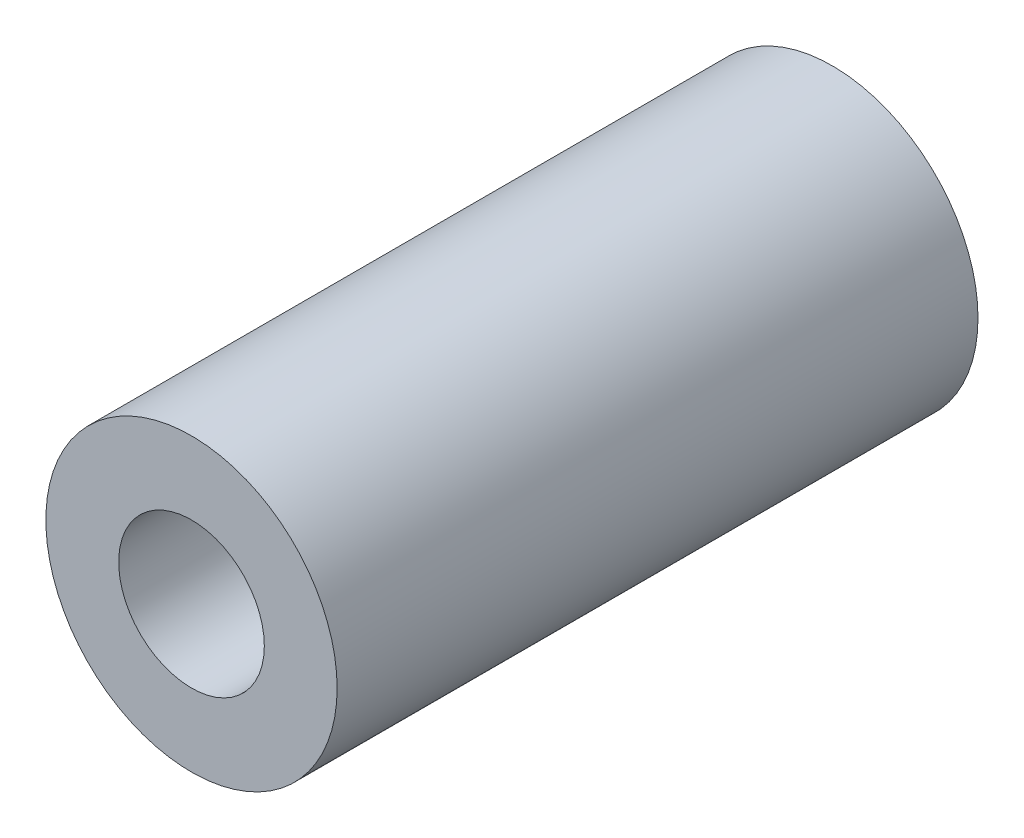
ISO-10303-21;
HEADER;
FILE_DESCRIPTION(('STEP AP214'),'2;1');
FILE_NAME('part.step','',(''),(''),'','','');
FILE_SCHEMA(('AUTOMOTIVE_DESIGN { 1 0 10303 214 1 1 1 1 }'));
ENDSEC;
DATA;
#1=APPLICATION_CONTEXT('core data for automotive mechanical design processes');
#2=APPLICATION_PROTOCOL_DEFINITION('international standard','automotive_design',2000,#1);
#3=PRODUCT_CONTEXT('',#1,'mechanical');
#4=PRODUCT('Part','Part','',(#3));
#5=PRODUCT_RELATED_PRODUCT_CATEGORY('part','',(#4));
#6=PRODUCT_DEFINITION_FORMATION('','',#4);
#7=PRODUCT_DEFINITION_CONTEXT('part definition',#1,'design');
#8=PRODUCT_DEFINITION('design','',#6,#7);
#9=PRODUCT_DEFINITION_SHAPE('','',#8);
#10=(LENGTH_UNIT() NAMED_UNIT(*) SI_UNIT(.MILLI.,.METRE.));
#11=(NAMED_UNIT(*) PLANE_ANGLE_UNIT() SI_UNIT($,.RADIAN.));
#12=(NAMED_UNIT(*) SI_UNIT($,.STERADIAN.) SOLID_ANGLE_UNIT());
#13=UNCERTAINTY_MEASURE_WITH_UNIT(LENGTH_MEASURE(1.E-05),#10,'distance_accuracy_value','');
#14=(GEOMETRIC_REPRESENTATION_CONTEXT(3) GLOBAL_UNCERTAINTY_ASSIGNED_CONTEXT((#13)) GLOBAL_UNIT_ASSIGNED_CONTEXT((#10,
#11,#12)) REPRESENTATION_CONTEXT('',''));
#15=CARTESIAN_POINT('',(0.,0.,0.));
#16=DIRECTION('',(0.,0.,1.));
#17=DIRECTION('',(1.,0.,0.));
#18=AXIS2_PLACEMENT_3D('',#15,#16,#17);
#19=CARTESIAN_POINT('',(0.,0.,22.));
#20=DIRECTION('',(0.,0.,1.));
#21=DIRECTION('',(1.,0.,0.));
#22=AXIS2_PLACEMENT_3D('',#19,#20,#21);
#23=PLANE('',#22);
#24=CARTESIAN_POINT('',(0.,0.,22.));
#25=DIRECTION('',(0.,0.,1.));
#26=DIRECTION('',(1.,0.,0.));
#27=AXIS2_PLACEMENT_3D('',#24,#25,#26);
#28=CIRCLE('',#27,5.);
#29=CARTESIAN_POINT('',(5.,0.,22.));
#30=VERTEX_POINT('',#29);
#31=EDGE_CURVE('E10',#30,#30,#28,.T.);
#32=ORIENTED_EDGE('',*,*,#31,.T.);
#33=EDGE_LOOP('',(#32));
#34=FACE_BOUND('',#33,.T.);
#35=CARTESIAN_POINT('',(0.,0.,22.));
#36=DIRECTION('',(0.,0.,1.));
#37=DIRECTION('',(1.,0.,0.));
#38=AXIS2_PLACEMENT_3D('',#35,#36,#37);
#39=CIRCLE('',#38,2.5);
#40=CARTESIAN_POINT('',(2.5,0.,22.));
#41=VERTEX_POINT('',#40);
#42=EDGE_CURVE('E48',#41,#41,#39,.T.);
#43=ORIENTED_EDGE('',*,*,#42,.F.);
#44=EDGE_LOOP('',(#43));
#45=FACE_BOUND('',#44,.T.);
#46=ADVANCED_FACE('F37',(#34,#45),#23,.T.);
#47=CARTESIAN_POINT('',(0.,0.,0.));
#48=DIRECTION('',(0.,0.,1.));
#49=DIRECTION('',(1.,0.,0.));
#50=AXIS2_PLACEMENT_3D('',#47,#48,#49);
#51=PLANE('',#50);
#52=CARTESIAN_POINT('',(0.,0.,0.));
#53=DIRECTION('',(0.,0.,1.));
#54=DIRECTION('',(1.,0.,0.));
#55=AXIS2_PLACEMENT_3D('',#52,#53,#54);
#56=CIRCLE('',#55,5.);
#57=CARTESIAN_POINT('',(5.,0.,0.));
#58=VERTEX_POINT('',#57);
#59=EDGE_CURVE('E41',#58,#58,#56,.T.);
#60=ORIENTED_EDGE('',*,*,#59,.F.);
#61=EDGE_LOOP('',(#60));
#62=FACE_BOUND('',#61,.T.);
#63=CARTESIAN_POINT('',(0.,0.,0.));
#64=DIRECTION('',(0.,0.,1.));
#65=DIRECTION('',(1.,0.,0.));
#66=AXIS2_PLACEMENT_3D('',#63,#64,#65);
#67=CIRCLE('',#66,2.5);
#68=CARTESIAN_POINT('',(2.5,0.,0.));
#69=VERTEX_POINT('',#68);
#70=EDGE_CURVE('E50',#69,#69,#67,.T.);
#71=ORIENTED_EDGE('',*,*,#70,.T.);
#72=EDGE_LOOP('',(#71));
#73=FACE_BOUND('',#72,.T.);
#74=ADVANCED_FACE('F60',(#62,#73),#51,.F.);
#75=CARTESIAN_POINT('',(0.,0.,22.));
#76=DIRECTION('',(0.,0.,-1.));
#77=DIRECTION('',(-1.,0.,0.));
#78=AXIS2_PLACEMENT_3D('',#75,#76,#77);
#79=CYLINDRICAL_SURFACE('',#78,5.);
#80=ORIENTED_EDGE('',*,*,#31,.F.);
#81=EDGE_LOOP('',(#80));
#82=FACE_BOUND('',#81,.T.);
#83=ORIENTED_EDGE('',*,*,#59,.T.);
#84=EDGE_LOOP('',(#83));
#85=FACE_BOUND('',#84,.T.);
#86=ADVANCED_FACE('F39',(#82,#85),#79,.T.);
#87=CARTESIAN_POINT('',(0.,0.,22.));
#88=DIRECTION('',(0.,0.,-1.));
#89=DIRECTION('',(-1.,0.,0.));
#90=AXIS2_PLACEMENT_3D('',#87,#88,#89);
#91=CYLINDRICAL_SURFACE('',#90,2.5);
#92=ORIENTED_EDGE('',*,*,#42,.T.);
#93=EDGE_LOOP('',(#92));
#94=FACE_BOUND('',#93,.T.);
#95=ORIENTED_EDGE('',*,*,#70,.F.);
#96=EDGE_LOOP('',(#95));
#97=FACE_BOUND('',#96,.T.);
#98=ADVANCED_FACE('F56',(#94,#97),#91,.F.);
#99=CLOSED_SHELL('',(#46,#74,#86,#98));
#100=MANIFOLD_SOLID_BREP('B2',#99);
#101=ADVANCED_BREP_SHAPE_REPRESENTATION('',(#18,#100),#14);
#102=SHAPE_DEFINITION_REPRESENTATION(#9,#101);
ENDSEC;
END-ISO-10303-21;
